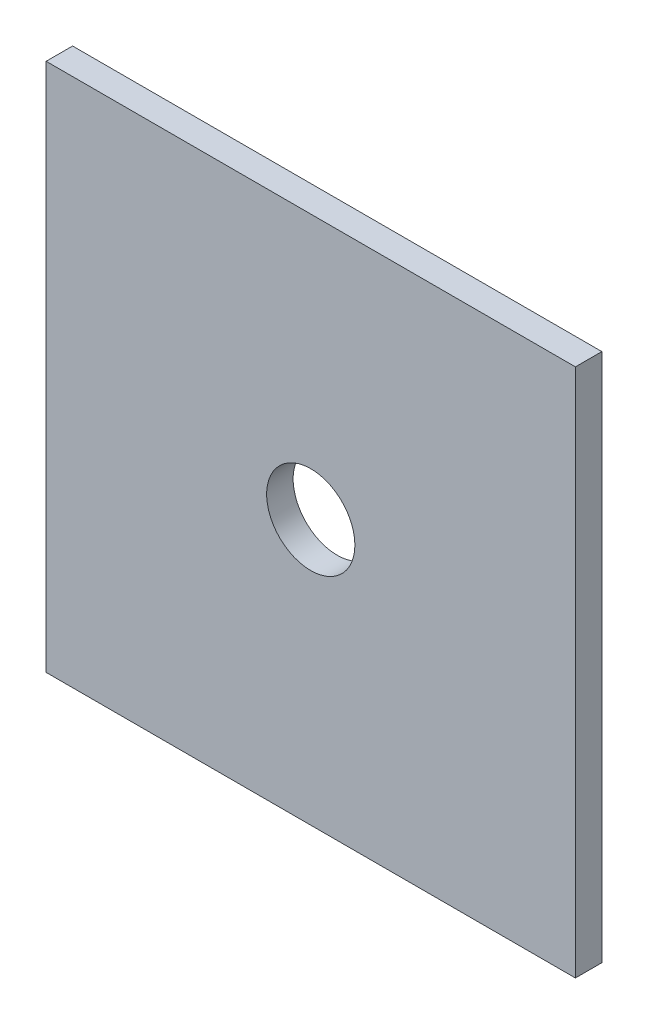
ISO-10303-21;
HEADER;
FILE_DESCRIPTION(('STEP AP214'),'2;1');
FILE_NAME('part.step','',(''),(''),'','','');
FILE_SCHEMA(('AUTOMOTIVE_DESIGN { 1 0 10303 214 1 1 1 1 }'));
ENDSEC;
DATA;
#1=APPLICATION_CONTEXT('core data for automotive mechanical design processes');
#2=APPLICATION_PROTOCOL_DEFINITION('international standard','automotive_design',2000,#1);
#3=PRODUCT_CONTEXT('',#1,'mechanical');
#4=PRODUCT('Part','Part','',(#3));
#5=PRODUCT_RELATED_PRODUCT_CATEGORY('part','',(#4));
#6=PRODUCT_DEFINITION_FORMATION('','',#4);
#7=PRODUCT_DEFINITION_CONTEXT('part definition',#1,'design');
#8=PRODUCT_DEFINITION('design','',#6,#7);
#9=PRODUCT_DEFINITION_SHAPE('','',#8);
#10=(LENGTH_UNIT() NAMED_UNIT(*) SI_UNIT(.MILLI.,.METRE.));
#11=(NAMED_UNIT(*) PLANE_ANGLE_UNIT() SI_UNIT($,.RADIAN.));
#12=(NAMED_UNIT(*) SI_UNIT($,.STERADIAN.) SOLID_ANGLE_UNIT());
#13=UNCERTAINTY_MEASURE_WITH_UNIT(LENGTH_MEASURE(1.E-05),#10,'distance_accuracy_value','');
#14=(GEOMETRIC_REPRESENTATION_CONTEXT(3) GLOBAL_UNCERTAINTY_ASSIGNED_CONTEXT((#13)) GLOBAL_UNIT_ASSIGNED_CONTEXT((#10,
#11,#12)) REPRESENTATION_CONTEXT('',''));
#15=CARTESIAN_POINT('',(0.,0.,0.));
#16=DIRECTION('',(0.,0.,1.));
#17=DIRECTION('',(1.,0.,0.));
#18=AXIS2_PLACEMENT_3D('',#15,#16,#17);
#19=CARTESIAN_POINT('',(0.,0.,15.));
#20=DIRECTION('',(0.,0.,1.));
#21=DIRECTION('',(1.,0.,0.));
#22=AXIS2_PLACEMENT_3D('',#19,#20,#21);
#23=PLANE('',#22);
#24=DIRECTION('',(0.,-1.,0.));
#25=VECTOR('',#24,1.);
#26=CARTESIAN_POINT('',(-150.,150.,15.));
#27=LINE('',#26,#25);
#28=CARTESIAN_POINT('',(-150.,150.,15.));
#29=VERTEX_POINT('',#28);
#30=CARTESIAN_POINT('',(-150.,-150.,15.));
#31=VERTEX_POINT('',#30);
#32=EDGE_CURVE('E89',#29,#31,#27,.T.);
#33=ORIENTED_EDGE('',*,*,#32,.T.);
#34=DIRECTION('',(1.,0.,0.));
#35=VECTOR('',#34,1.);
#36=CARTESIAN_POINT('',(-150.,-150.,15.));
#37=LINE('',#36,#35);
#38=CARTESIAN_POINT('',(150.,-150.,15.));
#39=VERTEX_POINT('',#38);
#40=EDGE_CURVE('E84',#31,#39,#37,.T.);
#41=ORIENTED_EDGE('',*,*,#40,.T.);
#42=DIRECTION('',(0.,1.,0.));
#43=VECTOR('',#42,1.);
#44=CARTESIAN_POINT('',(150.,150.,15.));
#45=LINE('',#44,#43);
#46=CARTESIAN_POINT('',(150.,150.,15.));
#47=VERTEX_POINT('',#46);
#48=EDGE_CURVE('E87',#39,#47,#45,.T.);
#49=ORIENTED_EDGE('',*,*,#48,.T.);
#50=DIRECTION('',(-1.,0.,0.));
#51=VECTOR('',#50,1.);
#52=CARTESIAN_POINT('',(-150.,150.,15.));
#53=LINE('',#52,#51);
#54=EDGE_CURVE('E54',#47,#29,#53,.T.);
#55=ORIENTED_EDGE('',*,*,#54,.T.);
#56=EDGE_LOOP('',(#33,#41,#49,#55));
#57=FACE_BOUND('',#56,.T.);
#58=CARTESIAN_POINT('',(0.,0.,15.));
#59=DIRECTION('',(0.,0.,1.));
#60=DIRECTION('',(1.,0.,0.));
#61=AXIS2_PLACEMENT_3D('',#58,#59,#60);
#62=CIRCLE('',#61,25.);
#63=CARTESIAN_POINT('',(25.,0.,15.));
#64=VERTEX_POINT('',#63);
#65=EDGE_CURVE('E104',#64,#64,#62,.T.);
#66=ORIENTED_EDGE('',*,*,#65,.F.);
#67=EDGE_LOOP('',(#66));
#68=FACE_BOUND('',#67,.T.);
#69=ADVANCED_FACE('F37',(#57,#68),#23,.T.);
#70=CARTESIAN_POINT('',(0.,0.,0.));
#71=DIRECTION('',(0.,0.,1.));
#72=DIRECTION('',(1.,0.,0.));
#73=AXIS2_PLACEMENT_3D('',#70,#71,#72);
#74=PLANE('',#73);
#75=DIRECTION('',(0.,-1.,0.));
#76=VECTOR('',#75,1.);
#77=CARTESIAN_POINT('',(-150.,150.,0.));
#78=LINE('',#77,#76);
#79=CARTESIAN_POINT('',(-150.,150.,0.));
#80=VERTEX_POINT('',#79);
#81=CARTESIAN_POINT('',(-150.,-150.,0.));
#82=VERTEX_POINT('',#81);
#83=EDGE_CURVE('E101',#80,#82,#78,.T.);
#84=ORIENTED_EDGE('',*,*,#83,.F.);
#85=DIRECTION('',(-1.,0.,0.));
#86=VECTOR('',#85,1.);
#87=CARTESIAN_POINT('',(-150.,150.,0.));
#88=LINE('',#87,#86);
#89=CARTESIAN_POINT('',(150.,150.,0.));
#90=VERTEX_POINT('',#89);
#91=EDGE_CURVE('E77',#90,#80,#88,.T.);
#92=ORIENTED_EDGE('',*,*,#91,.F.);
#93=DIRECTION('',(0.,1.,0.));
#94=VECTOR('',#93,1.);
#95=CARTESIAN_POINT('',(150.,150.,0.));
#96=LINE('',#95,#94);
#97=CARTESIAN_POINT('',(150.,-150.,0.));
#98=VERTEX_POINT('',#97);
#99=EDGE_CURVE('E71',#98,#90,#96,.T.);
#100=ORIENTED_EDGE('',*,*,#99,.F.);
#101=DIRECTION('',(1.,0.,0.));
#102=VECTOR('',#101,1.);
#103=CARTESIAN_POINT('',(-150.,-150.,0.));
#104=LINE('',#103,#102);
#105=EDGE_CURVE('E93',#82,#98,#104,.T.);
#106=ORIENTED_EDGE('',*,*,#105,.F.);
#107=EDGE_LOOP('',(#84,#92,#100,#106));
#108=FACE_BOUND('',#107,.T.);
#109=CARTESIAN_POINT('',(0.,0.,0.));
#110=DIRECTION('',(0.,0.,1.));
#111=DIRECTION('',(1.,0.,0.));
#112=AXIS2_PLACEMENT_3D('',#109,#110,#111);
#113=CIRCLE('',#112,25.);
#114=CARTESIAN_POINT('',(25.,0.,0.));
#115=VERTEX_POINT('',#114);
#116=EDGE_CURVE('E116',#115,#115,#113,.T.);
#117=ORIENTED_EDGE('',*,*,#116,.T.);
#118=EDGE_LOOP('',(#117));
#119=FACE_BOUND('',#118,.T.);
#120=ADVANCED_FACE('F112',(#108,#119),#74,.F.);
#121=CARTESIAN_POINT('',(-150.,150.,15.));
#122=DIRECTION('',(1.,0.,0.));
#123=DIRECTION('',(0.,0.,-1.));
#124=AXIS2_PLACEMENT_3D('',#121,#122,#123);
#125=PLANE('',#124);
#126=ORIENTED_EDGE('',*,*,#83,.T.);
#127=DIRECTION('',(0.,0.,-1.));
#128=VECTOR('',#127,1.);
#129=CARTESIAN_POINT('',(-150.,-150.,15.));
#130=LINE('',#129,#128);
#131=EDGE_CURVE('E11',#31,#82,#130,.T.);
#132=ORIENTED_EDGE('',*,*,#131,.F.);
#133=ORIENTED_EDGE('',*,*,#32,.F.);
#134=DIRECTION('',(0.,0.,-1.));
#135=VECTOR('',#134,1.);
#136=CARTESIAN_POINT('',(-150.,150.,15.));
#137=LINE('',#136,#135);
#138=EDGE_CURVE('E97',#29,#80,#137,.T.);
#139=ORIENTED_EDGE('',*,*,#138,.T.);
#140=EDGE_LOOP('',(#126,#132,#133,#139));
#141=FACE_BOUND('',#140,.T.);
#142=ADVANCED_FACE('F39',(#141),#125,.F.);
#143=CARTESIAN_POINT('',(-150.,-150.,15.));
#144=DIRECTION('',(0.,1.,0.));
#145=DIRECTION('',(0.,0.,1.));
#146=AXIS2_PLACEMENT_3D('',#143,#144,#145);
#147=PLANE('',#146);
#148=ORIENTED_EDGE('',*,*,#105,.T.);
#149=DIRECTION('',(0.,0.,-1.));
#150=VECTOR('',#149,1.);
#151=CARTESIAN_POINT('',(150.,-150.,15.));
#152=LINE('',#151,#150);
#153=EDGE_CURVE('E46',#39,#98,#152,.T.);
#154=ORIENTED_EDGE('',*,*,#153,.F.);
#155=ORIENTED_EDGE('',*,*,#40,.F.);
#156=ORIENTED_EDGE('',*,*,#131,.T.);
#157=EDGE_LOOP('',(#148,#154,#155,#156));
#158=FACE_BOUND('',#157,.T.);
#159=ADVANCED_FACE('F92',(#158),#147,.F.);
#160=CARTESIAN_POINT('',(150.,150.,15.));
#161=DIRECTION('',(-1.,0.,0.));
#162=DIRECTION('',(0.,0.,1.));
#163=AXIS2_PLACEMENT_3D('',#160,#161,#162);
#164=PLANE('',#163);
#165=ORIENTED_EDGE('',*,*,#99,.T.);
#166=DIRECTION('',(0.,0.,-1.));
#167=VECTOR('',#166,1.);
#168=CARTESIAN_POINT('',(150.,150.,15.));
#169=LINE('',#168,#167);
#170=EDGE_CURVE('E94',#47,#90,#169,.T.);
#171=ORIENTED_EDGE('',*,*,#170,.F.);
#172=ORIENTED_EDGE('',*,*,#48,.F.);
#173=ORIENTED_EDGE('',*,*,#153,.T.);
#174=EDGE_LOOP('',(#165,#171,#172,#173));
#175=FACE_BOUND('',#174,.T.);
#176=ADVANCED_FACE('F95',(#175),#164,.F.);
#177=CARTESIAN_POINT('',(-150.,150.,15.));
#178=DIRECTION('',(0.,-1.,0.));
#179=DIRECTION('',(0.,0.,-1.));
#180=AXIS2_PLACEMENT_3D('',#177,#178,#179);
#181=PLANE('',#180);
#182=ORIENTED_EDGE('',*,*,#91,.T.);
#183=ORIENTED_EDGE('',*,*,#138,.F.);
#184=ORIENTED_EDGE('',*,*,#54,.F.);
#185=ORIENTED_EDGE('',*,*,#170,.T.);
#186=EDGE_LOOP('',(#182,#183,#184,#185));
#187=FACE_BOUND('',#186,.T.);
#188=ADVANCED_FACE('F109',(#187),#181,.F.);
#189=CARTESIAN_POINT('',(0.,0.,15.));
#190=DIRECTION('',(0.,0.,-1.));
#191=DIRECTION('',(-1.,0.,0.));
#192=AXIS2_PLACEMENT_3D('',#189,#190,#191);
#193=CYLINDRICAL_SURFACE('',#192,25.);
#194=ORIENTED_EDGE('',*,*,#65,.T.);
#195=EDGE_LOOP('',(#194));
#196=FACE_BOUND('',#195,.T.);
#197=ORIENTED_EDGE('',*,*,#116,.F.);
#198=EDGE_LOOP('',(#197));
#199=FACE_BOUND('',#198,.T.);
#200=ADVANCED_FACE('F122',(#196,#199),#193,.F.);
#201=CLOSED_SHELL('',(#69,#120,#142,#159,#176,#188,#200));
#202=MANIFOLD_SOLID_BREP('B2',#201);
#203=ADVANCED_BREP_SHAPE_REPRESENTATION('',(#18,#202),#14);
#204=SHAPE_DEFINITION_REPRESENTATION(#9,#203);
ENDSEC;
END-ISO-10303-21;
